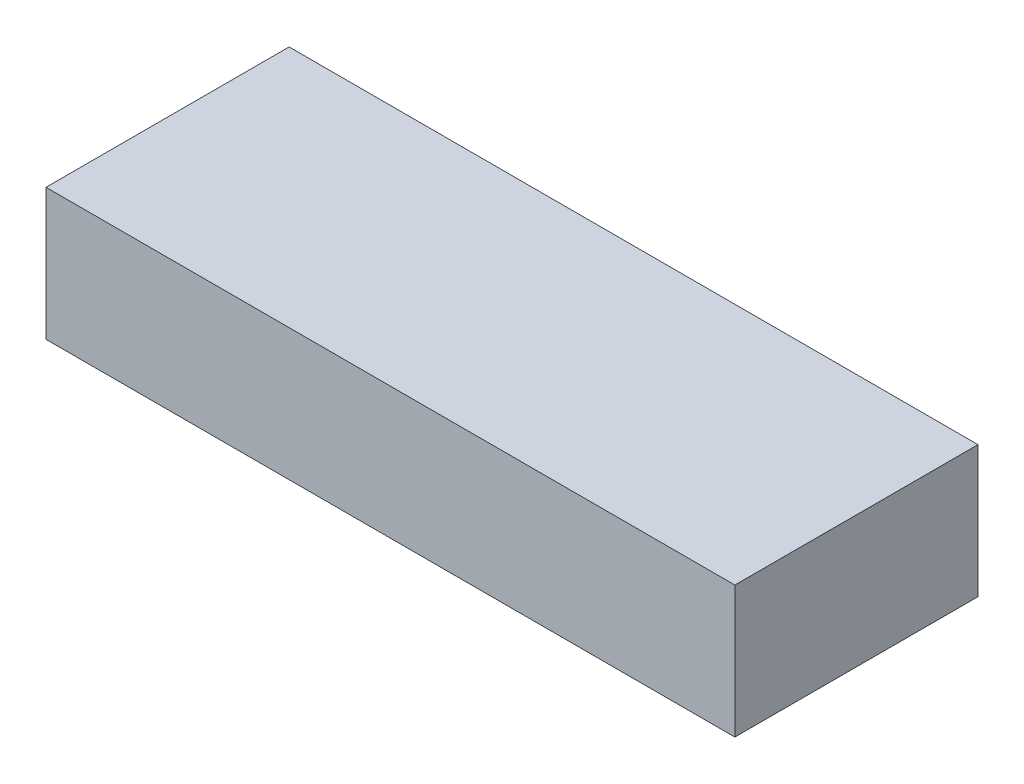
ISO-10303-21;
HEADER;
FILE_DESCRIPTION(('STEP AP214'),'2;1');
FILE_NAME('part.step','',(''),(''),'','','');
FILE_SCHEMA(('AUTOMOTIVE_DESIGN { 1 0 10303 214 1 1 1 1 }'));
ENDSEC;
DATA;
#1=APPLICATION_CONTEXT('core data for automotive mechanical design processes');
#2=APPLICATION_PROTOCOL_DEFINITION('international standard','automotive_design',2000,#1);
#3=PRODUCT_CONTEXT('',#1,'mechanical');
#4=PRODUCT('Part','Part','',(#3));
#5=PRODUCT_RELATED_PRODUCT_CATEGORY('part','',(#4));
#6=PRODUCT_DEFINITION_FORMATION('','',#4);
#7=PRODUCT_DEFINITION_CONTEXT('part definition',#1,'design');
#8=PRODUCT_DEFINITION('design','',#6,#7);
#9=PRODUCT_DEFINITION_SHAPE('','',#8);
#10=(LENGTH_UNIT() NAMED_UNIT(*) SI_UNIT(.MILLI.,.METRE.));
#11=(NAMED_UNIT(*) PLANE_ANGLE_UNIT() SI_UNIT($,.RADIAN.));
#12=(NAMED_UNIT(*) SI_UNIT($,.STERADIAN.) SOLID_ANGLE_UNIT());
#13=UNCERTAINTY_MEASURE_WITH_UNIT(LENGTH_MEASURE(1.E-05),#10,'distance_accuracy_value','');
#14=(GEOMETRIC_REPRESENTATION_CONTEXT(3) GLOBAL_UNCERTAINTY_ASSIGNED_CONTEXT((#13)) GLOBAL_UNIT_ASSIGNED_CONTEXT((#10,
#11,#12)) REPRESENTATION_CONTEXT('',''));
#15=CARTESIAN_POINT('',(0.,0.,0.));
#16=DIRECTION('',(0.,0.,1.));
#17=DIRECTION('',(1.,0.,0.));
#18=AXIS2_PLACEMENT_3D('',#15,#16,#17);
#19=CARTESIAN_POINT('',(86.36,0.,0.));
#20=DIRECTION('',(0.,0.,-1.));
#21=DIRECTION('',(-1.,0.,0.));
#22=AXIS2_PLACEMENT_3D('',#19,#20,#21);
#23=PLANE('',#22);
#24=DIRECTION('',(0.,-1.,0.));
#25=VECTOR('',#24,1.);
#26=CARTESIAN_POINT('',(0.,0.,0.));
#27=LINE('',#26,#25);
#28=CARTESIAN_POINT('',(0.,16.51,0.));
#29=VERTEX_POINT('',#28);
#30=CARTESIAN_POINT('',(0.,0.,0.));
#31=VERTEX_POINT('',#30);
#32=EDGE_CURVE('E96',#29,#31,#27,.T.);
#33=ORIENTED_EDGE('',*,*,#32,.T.);
#34=DIRECTION('',(-1.,0.,0.));
#35=VECTOR('',#34,1.);
#36=CARTESIAN_POINT('',(86.36,0.,0.));
#37=LINE('',#36,#35);
#38=CARTESIAN_POINT('',(86.36,0.,0.));
#39=VERTEX_POINT('',#38);
#40=EDGE_CURVE('E11',#39,#31,#37,.T.);
#41=ORIENTED_EDGE('',*,*,#40,.F.);
#42=DIRECTION('',(0.,-1.,0.));
#43=VECTOR('',#42,1.);
#44=CARTESIAN_POINT('',(86.36,0.,0.));
#45=LINE('',#44,#43);
#46=CARTESIAN_POINT('',(86.36,16.51,0.));
#47=VERTEX_POINT('',#46);
#48=EDGE_CURVE('E84',#47,#39,#45,.T.);
#49=ORIENTED_EDGE('',*,*,#48,.F.);
#50=DIRECTION('',(-1.,0.,0.));
#51=VECTOR('',#50,1.);
#52=CARTESIAN_POINT('',(86.36,16.51,0.));
#53=LINE('',#52,#51);
#54=EDGE_CURVE('E92',#47,#29,#53,.T.);
#55=ORIENTED_EDGE('',*,*,#54,.T.);
#56=EDGE_LOOP('',(#33,#41,#49,#55));
#57=FACE_BOUND('',#56,.T.);
#58=ADVANCED_FACE('F33',(#57),#23,.F.);
#59=CARTESIAN_POINT('',(86.36,0.,0.));
#60=DIRECTION('',(0.,1.,0.));
#61=DIRECTION('',(0.,0.,1.));
#62=AXIS2_PLACEMENT_3D('',#59,#60,#61);
#63=PLANE('',#62);
#64=DIRECTION('',(0.,0.,-1.));
#65=VECTOR('',#64,1.);
#66=CARTESIAN_POINT('',(0.,0.,0.));
#67=LINE('',#66,#65);
#68=CARTESIAN_POINT('',(0.,0.,-30.48));
#69=VERTEX_POINT('',#68);
#70=EDGE_CURVE('E88',#31,#69,#67,.T.);
#71=ORIENTED_EDGE('',*,*,#70,.T.);
#72=DIRECTION('',(-1.,0.,0.));
#73=VECTOR('',#72,1.);
#74=CARTESIAN_POINT('',(86.36,0.,-30.48));
#75=LINE('',#74,#73);
#76=CARTESIAN_POINT('',(86.36,0.,-30.48));
#77=VERTEX_POINT('',#76);
#78=EDGE_CURVE('E41',#77,#69,#75,.T.);
#79=ORIENTED_EDGE('',*,*,#78,.F.);
#80=DIRECTION('',(0.,0.,-1.));
#81=VECTOR('',#80,1.);
#82=CARTESIAN_POINT('',(86.36,0.,0.));
#83=LINE('',#82,#81);
#84=EDGE_CURVE('E79',#39,#77,#83,.T.);
#85=ORIENTED_EDGE('',*,*,#84,.F.);
#86=ORIENTED_EDGE('',*,*,#40,.T.);
#87=EDGE_LOOP('',(#71,#79,#85,#86));
#88=FACE_BOUND('',#87,.T.);
#89=ADVANCED_FACE('F87',(#88),#63,.F.);
#90=CARTESIAN_POINT('',(86.36,0.,-30.48));
#91=DIRECTION('',(0.,0.,1.));
#92=DIRECTION('',(1.,0.,0.));
#93=AXIS2_PLACEMENT_3D('',#90,#91,#92);
#94=PLANE('',#93);
#95=DIRECTION('',(0.,1.,0.));
#96=VECTOR('',#95,1.);
#97=CARTESIAN_POINT('',(0.,0.,-30.48));
#98=LINE('',#97,#96);
#99=CARTESIAN_POINT('',(0.,16.51,-30.48));
#100=VERTEX_POINT('',#99);
#101=EDGE_CURVE('E66',#69,#100,#98,.T.);
#102=ORIENTED_EDGE('',*,*,#101,.T.);
#103=DIRECTION('',(-1.,0.,0.));
#104=VECTOR('',#103,1.);
#105=CARTESIAN_POINT('',(86.36,16.51,-30.48));
#106=LINE('',#105,#104);
#107=CARTESIAN_POINT('',(86.36,16.51,-30.48));
#108=VERTEX_POINT('',#107);
#109=EDGE_CURVE('E89',#108,#100,#106,.T.);
#110=ORIENTED_EDGE('',*,*,#109,.F.);
#111=DIRECTION('',(0.,1.,0.));
#112=VECTOR('',#111,1.);
#113=CARTESIAN_POINT('',(86.36,0.,-30.48));
#114=LINE('',#113,#112);
#115=EDGE_CURVE('E82',#77,#108,#114,.T.);
#116=ORIENTED_EDGE('',*,*,#115,.F.);
#117=ORIENTED_EDGE('',*,*,#78,.T.);
#118=EDGE_LOOP('',(#102,#110,#116,#117));
#119=FACE_BOUND('',#118,.T.);
#120=ADVANCED_FACE('F90',(#119),#94,.F.);
#121=CARTESIAN_POINT('',(86.36,16.51,0.));
#122=DIRECTION('',(0.,-1.,0.));
#123=DIRECTION('',(0.,0.,-1.));
#124=AXIS2_PLACEMENT_3D('',#121,#122,#123);
#125=PLANE('',#124);
#126=DIRECTION('',(0.,0.,1.));
#127=VECTOR('',#126,1.);
#128=CARTESIAN_POINT('',(0.,16.51,0.));
#129=LINE('',#128,#127);
#130=EDGE_CURVE('E72',#100,#29,#129,.T.);
#131=ORIENTED_EDGE('',*,*,#130,.T.);
#132=ORIENTED_EDGE('',*,*,#54,.F.);
#133=DIRECTION('',(0.,0.,1.));
#134=VECTOR('',#133,1.);
#135=CARTESIAN_POINT('',(86.36,16.51,0.));
#136=LINE('',#135,#134);
#137=EDGE_CURVE('E49',#108,#47,#136,.T.);
#138=ORIENTED_EDGE('',*,*,#137,.F.);
#139=ORIENTED_EDGE('',*,*,#109,.T.);
#140=EDGE_LOOP('',(#131,#132,#138,#139));
#141=FACE_BOUND('',#140,.T.);
#142=ADVANCED_FACE('F103',(#141),#125,.F.);
#143=CARTESIAN_POINT('',(86.36,0.,0.));
#144=DIRECTION('',(-1.,0.,0.));
#145=DIRECTION('',(0.,0.,1.));
#146=AXIS2_PLACEMENT_3D('',#143,#144,#145);
#147=PLANE('',#146);
#148=ORIENTED_EDGE('',*,*,#48,.T.);
#149=ORIENTED_EDGE('',*,*,#84,.T.);
#150=ORIENTED_EDGE('',*,*,#115,.T.);
#151=ORIENTED_EDGE('',*,*,#137,.T.);
#152=EDGE_LOOP('',(#148,#149,#150,#151));
#153=FACE_BOUND('',#152,.T.);
#154=ADVANCED_FACE('F80',(#153),#147,.F.);
#155=CARTESIAN_POINT('',(0.,0.,0.));
#156=DIRECTION('',(-1.,0.,0.));
#157=DIRECTION('',(0.,0.,1.));
#158=AXIS2_PLACEMENT_3D('',#155,#156,#157);
#159=PLANE('',#158);
#160=ORIENTED_EDGE('',*,*,#32,.F.);
#161=ORIENTED_EDGE('',*,*,#130,.F.);
#162=ORIENTED_EDGE('',*,*,#101,.F.);
#163=ORIENTED_EDGE('',*,*,#70,.F.);
#164=EDGE_LOOP('',(#160,#161,#162,#163));
#165=FACE_BOUND('',#164,.T.);
#166=ADVANCED_FACE('F106',(#165),#159,.T.);
#167=CLOSED_SHELL('',(#58,#89,#120,#142,#154,#166));
#168=MANIFOLD_SOLID_BREP('B2',#167);
#169=ADVANCED_BREP_SHAPE_REPRESENTATION('',(#18,#168),#14);
#170=SHAPE_DEFINITION_REPRESENTATION(#9,#169);
ENDSEC;
END-ISO-10303-21;
